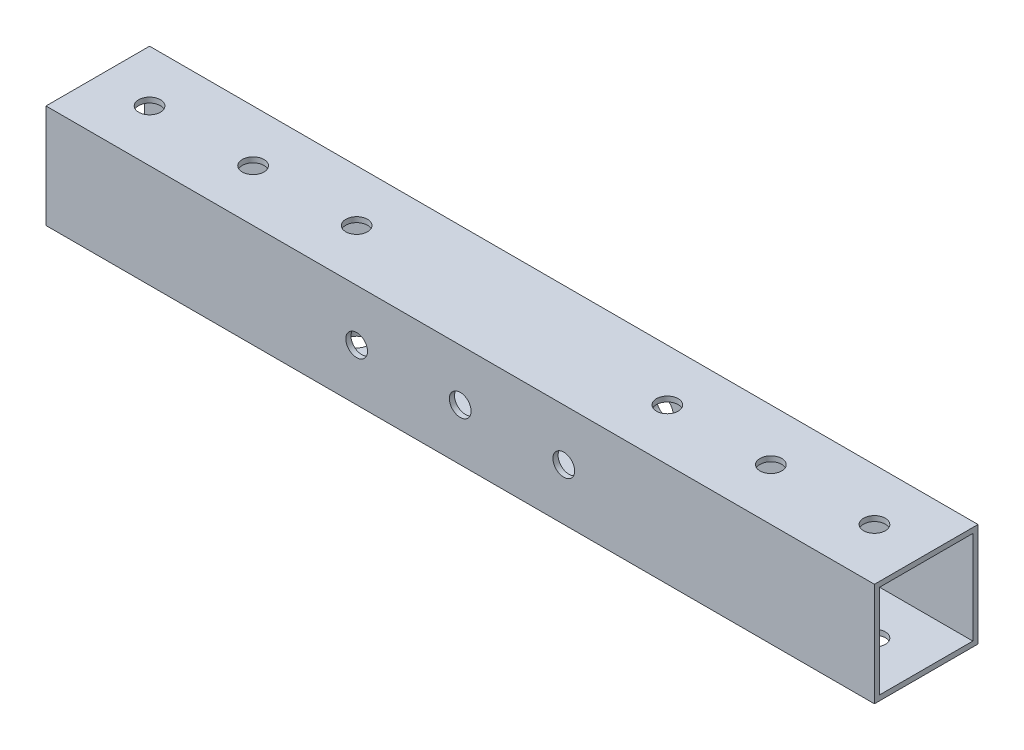
ISO-10303-21;
HEADER;
FILE_DESCRIPTION(('STEP AP214'),'2;1');
FILE_NAME('part.step','',(''),(''),'','','');
FILE_SCHEMA(('AUTOMOTIVE_DESIGN { 1 0 10303 214 1 1 1 1 }'));
ENDSEC;
DATA;
#1=APPLICATION_CONTEXT('core data for automotive mechanical design processes');
#2=APPLICATION_PROTOCOL_DEFINITION('international standard','automotive_design',2000,#1);
#3=PRODUCT_CONTEXT('',#1,'mechanical');
#4=PRODUCT('Part','Part','',(#3));
#5=PRODUCT_RELATED_PRODUCT_CATEGORY('part','',(#4));
#6=PRODUCT_DEFINITION_FORMATION('','',#4);
#7=PRODUCT_DEFINITION_CONTEXT('part definition',#1,'design');
#8=PRODUCT_DEFINITION('design','',#6,#7);
#9=PRODUCT_DEFINITION_SHAPE('','',#8);
#10=(LENGTH_UNIT() NAMED_UNIT(*) SI_UNIT(.MILLI.,.METRE.));
#11=(NAMED_UNIT(*) PLANE_ANGLE_UNIT() SI_UNIT($,.RADIAN.));
#12=(NAMED_UNIT(*) SI_UNIT($,.STERADIAN.) SOLID_ANGLE_UNIT());
#13=UNCERTAINTY_MEASURE_WITH_UNIT(LENGTH_MEASURE(1.E-05),#10,'distance_accuracy_value','');
#14=(GEOMETRIC_REPRESENTATION_CONTEXT(3) GLOBAL_UNCERTAINTY_ASSIGNED_CONTEXT((#13)) GLOBAL_UNIT_ASSIGNED_CONTEXT((#10,
#11,#12)) REPRESENTATION_CONTEXT('',''));
#15=CARTESIAN_POINT('',(0.,0.,0.));
#16=DIRECTION('',(0.,0.,1.));
#17=DIRECTION('',(1.,0.,0.));
#18=AXIS2_PLACEMENT_3D('',#15,#16,#17);
#19=CARTESIAN_POINT('',(150.,150.,0.));
#20=DIRECTION('',(0.,-1.,0.));
#21=DIRECTION('',(0.,0.,-1.));
#22=AXIS2_PLACEMENT_3D('',#19,#20,#21);
#23=CYLINDRICAL_SURFACE('',#22,2.10000000000002);
#24=CARTESIAN_POINT('',(150.,-9.00000000000001,0.));
#25=DIRECTION('',(0.,-1.,0.));
#26=DIRECTION('',(0.,0.,-1.));
#27=AXIS2_PLACEMENT_3D('',#24,#25,#26);
#28=CIRCLE('',#27,2.10000000000002);
#29=CARTESIAN_POINT('',(150.,-9.00000000000001,-2.10000000000002));
#30=VERTEX_POINT('',#29);
#31=EDGE_CURVE('E211',#30,#30,#28,.F.);
#32=ORIENTED_EDGE('',*,*,#31,.T.);
#33=EDGE_LOOP('',(#32));
#34=FACE_BOUND('',#33,.T.);
#35=CARTESIAN_POINT('',(150.,-10.,0.));
#36=DIRECTION('',(0.,-1.,0.));
#37=DIRECTION('',(0.,0.,1.));
#38=AXIS2_PLACEMENT_3D('',#35,#36,#37);
#39=CIRCLE('',#38,2.10000000000002);
#40=CARTESIAN_POINT('',(150.,-10.,2.10000000000002));
#41=VERTEX_POINT('',#40);
#42=EDGE_CURVE('E220',#41,#41,#39,.T.);
#43=ORIENTED_EDGE('',*,*,#42,.T.);
#44=EDGE_LOOP('',(#43));
#45=FACE_BOUND('',#44,.T.);
#46=ADVANCED_FACE('F38',(#34,#45),#23,.F.);
#47=CARTESIAN_POINT('',(130.,150.,0.));
#48=DIRECTION('',(0.,-1.,0.));
#49=DIRECTION('',(0.,0.,-1.));
#50=AXIS2_PLACEMENT_3D('',#47,#48,#49);
#51=CYLINDRICAL_SURFACE('',#50,2.09999999999999);
#52=CARTESIAN_POINT('',(130.,-9.00000000000001,0.));
#53=DIRECTION('',(0.,-1.,0.));
#54=DIRECTION('',(0.,0.,-1.));
#55=AXIS2_PLACEMENT_3D('',#52,#53,#54);
#56=CIRCLE('',#55,2.09999999999999);
#57=CARTESIAN_POINT('',(130.,-9.00000000000001,-2.09999999999999));
#58=VERTEX_POINT('',#57);
#59=EDGE_CURVE('E207',#58,#58,#56,.F.);
#60=ORIENTED_EDGE('',*,*,#59,.T.);
#61=EDGE_LOOP('',(#60));
#62=FACE_BOUND('',#61,.T.);
#63=CARTESIAN_POINT('',(130.,-10.,0.));
#64=DIRECTION('',(0.,-1.,0.));
#65=DIRECTION('',(0.,0.,1.));
#66=AXIS2_PLACEMENT_3D('',#63,#64,#65);
#67=CIRCLE('',#66,2.09999999999999);
#68=CARTESIAN_POINT('',(130.,-10.,2.09999999999999));
#69=VERTEX_POINT('',#68);
#70=EDGE_CURVE('E257',#69,#69,#67,.T.);
#71=ORIENTED_EDGE('',*,*,#70,.T.);
#72=EDGE_LOOP('',(#71));
#73=FACE_BOUND('',#72,.T.);
#74=ADVANCED_FACE('F354',(#62,#73),#51,.F.);
#75=CARTESIAN_POINT('',(110.,150.,0.));
#76=DIRECTION('',(0.,-1.,0.));
#77=DIRECTION('',(0.,0.,-1.));
#78=AXIS2_PLACEMENT_3D('',#75,#76,#77);
#79=CYLINDRICAL_SURFACE('',#78,2.1);
#80=CARTESIAN_POINT('',(110.,-9.00000000000001,0.));
#81=DIRECTION('',(0.,-1.,0.));
#82=DIRECTION('',(0.,0.,-1.));
#83=AXIS2_PLACEMENT_3D('',#80,#81,#82);
#84=CIRCLE('',#83,2.1);
#85=CARTESIAN_POINT('',(110.,-9.00000000000001,-2.1));
#86=VERTEX_POINT('',#85);
#87=EDGE_CURVE('E203',#86,#86,#84,.F.);
#88=ORIENTED_EDGE('',*,*,#87,.T.);
#89=EDGE_LOOP('',(#88));
#90=FACE_BOUND('',#89,.T.);
#91=CARTESIAN_POINT('',(110.,-10.,0.));
#92=DIRECTION('',(0.,-1.,0.));
#93=DIRECTION('',(0.,0.,1.));
#94=AXIS2_PLACEMENT_3D('',#91,#92,#93);
#95=CIRCLE('',#94,2.1);
#96=CARTESIAN_POINT('',(110.,-10.,2.1));
#97=VERTEX_POINT('',#96);
#98=EDGE_CURVE('E253',#97,#97,#95,.T.);
#99=ORIENTED_EDGE('',*,*,#98,.T.);
#100=EDGE_LOOP('',(#99));
#101=FACE_BOUND('',#100,.T.);
#102=ADVANCED_FACE('F362',(#90,#101),#79,.F.);
#103=CARTESIAN_POINT('',(50.,150.,0.));
#104=DIRECTION('',(0.,-1.,0.));
#105=DIRECTION('',(0.,0.,-1.));
#106=AXIS2_PLACEMENT_3D('',#103,#104,#105);
#107=CYLINDRICAL_SURFACE('',#106,2.1);
#108=CARTESIAN_POINT('',(50.,-9.00000000000001,0.));
#109=DIRECTION('',(0.,-1.,0.));
#110=DIRECTION('',(0.,0.,-1.));
#111=AXIS2_PLACEMENT_3D('',#108,#109,#110);
#112=CIRCLE('',#111,2.1);
#113=CARTESIAN_POINT('',(50.,-9.00000000000001,-2.1));
#114=VERTEX_POINT('',#113);
#115=EDGE_CURVE('E199',#114,#114,#112,.F.);
#116=ORIENTED_EDGE('',*,*,#115,.T.);
#117=EDGE_LOOP('',(#116));
#118=FACE_BOUND('',#117,.T.);
#119=CARTESIAN_POINT('',(50.,-10.,0.));
#120=DIRECTION('',(0.,-1.,0.));
#121=DIRECTION('',(0.,0.,-1.));
#122=AXIS2_PLACEMENT_3D('',#119,#120,#121);
#123=CIRCLE('',#122,2.1);
#124=CARTESIAN_POINT('',(50.,-10.,-2.1));
#125=VERTEX_POINT('',#124);
#126=EDGE_CURVE('E249',#125,#125,#123,.T.);
#127=ORIENTED_EDGE('',*,*,#126,.T.);
#128=EDGE_LOOP('',(#127));
#129=FACE_BOUND('',#128,.T.);
#130=ADVANCED_FACE('F486',(#118,#129),#107,.F.);
#131=CARTESIAN_POINT('',(30.,150.,0.));
#132=DIRECTION('',(0.,-1.,0.));
#133=DIRECTION('',(0.,0.,-1.));
#134=AXIS2_PLACEMENT_3D('',#131,#132,#133);
#135=CYLINDRICAL_SURFACE('',#134,2.1);
#136=CARTESIAN_POINT('',(30.,-9.00000000000001,0.));
#137=DIRECTION('',(0.,-1.,0.));
#138=DIRECTION('',(0.,0.,-1.));
#139=AXIS2_PLACEMENT_3D('',#136,#137,#138);
#140=CIRCLE('',#139,2.1);
#141=CARTESIAN_POINT('',(30.,-9.00000000000001,-2.1));
#142=VERTEX_POINT('',#141);
#143=EDGE_CURVE('E195',#142,#142,#140,.F.);
#144=ORIENTED_EDGE('',*,*,#143,.T.);
#145=EDGE_LOOP('',(#144));
#146=FACE_BOUND('',#145,.T.);
#147=CARTESIAN_POINT('',(30.,-10.,0.));
#148=DIRECTION('',(0.,-1.,0.));
#149=DIRECTION('',(0.,0.,-1.));
#150=AXIS2_PLACEMENT_3D('',#147,#148,#149);
#151=CIRCLE('',#150,2.1);
#152=CARTESIAN_POINT('',(30.,-10.,-2.1));
#153=VERTEX_POINT('',#152);
#154=EDGE_CURVE('E245',#153,#153,#151,.T.);
#155=ORIENTED_EDGE('',*,*,#154,.T.);
#156=EDGE_LOOP('',(#155));
#157=FACE_BOUND('',#156,.T.);
#158=ADVANCED_FACE('F435',(#146,#157),#135,.F.);
#159=CARTESIAN_POINT('',(10.,150.,0.));
#160=DIRECTION('',(0.,-1.,0.));
#161=DIRECTION('',(0.,0.,-1.));
#162=AXIS2_PLACEMENT_3D('',#159,#160,#161);
#163=CYLINDRICAL_SURFACE('',#162,2.1);
#164=CARTESIAN_POINT('',(10.,-9.00000000000001,0.));
#165=DIRECTION('',(0.,-1.,0.));
#166=DIRECTION('',(0.,0.,-1.));
#167=AXIS2_PLACEMENT_3D('',#164,#165,#166);
#168=CIRCLE('',#167,2.1);
#169=CARTESIAN_POINT('',(10.,-9.00000000000001,-2.1));
#170=VERTEX_POINT('',#169);
#171=EDGE_CURVE('E42',#170,#170,#168,.F.);
#172=ORIENTED_EDGE('',*,*,#171,.T.);
#173=EDGE_LOOP('',(#172));
#174=FACE_BOUND('',#173,.T.);
#175=CARTESIAN_POINT('',(10.,-10.,0.));
#176=DIRECTION('',(0.,-1.,0.));
#177=DIRECTION('',(0.,0.,-1.));
#178=AXIS2_PLACEMENT_3D('',#175,#176,#177);
#179=CIRCLE('',#178,2.1);
#180=CARTESIAN_POINT('',(10.,-10.,-2.1));
#181=VERTEX_POINT('',#180);
#182=EDGE_CURVE('E240',#181,#181,#179,.T.);
#183=ORIENTED_EDGE('',*,*,#182,.T.);
#184=EDGE_LOOP('',(#183));
#185=FACE_BOUND('',#184,.T.);
#186=ADVANCED_FACE('F423',(#174,#185),#163,.F.);
#187=CARTESIAN_POINT('',(100.,0.,-10.));
#188=DIRECTION('',(0.,0.,1.));
#189=DIRECTION('',(1.,0.,0.));
#190=AXIS2_PLACEMENT_3D('',#187,#188,#189);
#191=CYLINDRICAL_SURFACE('',#190,2.09999999999999);
#192=CARTESIAN_POINT('',(100.,0.,9.));
#193=DIRECTION('',(0.,0.,1.));
#194=DIRECTION('',(0.,-1.,0.));
#195=AXIS2_PLACEMENT_3D('',#192,#193,#194);
#196=CIRCLE('',#195,2.09999999999999);
#197=CARTESIAN_POINT('',(100.,-2.09999999999998,9.));
#198=VERTEX_POINT('',#197);
#199=EDGE_CURVE('E170',#198,#198,#196,.F.);
#200=ORIENTED_EDGE('',*,*,#199,.T.);
#201=EDGE_LOOP('',(#200));
#202=FACE_BOUND('',#201,.T.);
#203=CARTESIAN_POINT('',(100.,0.,10.));
#204=DIRECTION('',(0.,0.,1.));
#205=DIRECTION('',(1.,0.,0.));
#206=AXIS2_PLACEMENT_3D('',#203,#204,#205);
#207=CIRCLE('',#206,2.09999999999999);
#208=CARTESIAN_POINT('',(102.1,0.,10.));
#209=VERTEX_POINT('',#208);
#210=EDGE_CURVE('E215',#209,#209,#207,.T.);
#211=ORIENTED_EDGE('',*,*,#210,.T.);
#212=EDGE_LOOP('',(#211));
#213=FACE_BOUND('',#212,.T.);
#214=ADVANCED_FACE('F420',(#202,#213),#191,.F.);
#215=CARTESIAN_POINT('',(80.,0.,-10.));
#216=DIRECTION('',(0.,0.,1.));
#217=DIRECTION('',(1.,0.,0.));
#218=AXIS2_PLACEMENT_3D('',#215,#216,#217);
#219=CYLINDRICAL_SURFACE('',#218,2.1);
#220=CARTESIAN_POINT('',(80.,0.,9.));
#221=DIRECTION('',(0.,0.,1.));
#222=DIRECTION('',(0.,-1.,0.));
#223=AXIS2_PLACEMENT_3D('',#220,#221,#222);
#224=CIRCLE('',#223,2.1);
#225=CARTESIAN_POINT('',(80.,-2.09999999999999,9.));
#226=VERTEX_POINT('',#225);
#227=EDGE_CURVE('E166',#226,#226,#224,.F.);
#228=ORIENTED_EDGE('',*,*,#227,.T.);
#229=EDGE_LOOP('',(#228));
#230=FACE_BOUND('',#229,.T.);
#231=CARTESIAN_POINT('',(80.,0.,10.));
#232=DIRECTION('',(0.,0.,1.));
#233=DIRECTION('',(1.,0.,0.));
#234=AXIS2_PLACEMENT_3D('',#231,#232,#233);
#235=CIRCLE('',#234,2.1);
#236=CARTESIAN_POINT('',(82.1,0.,10.));
#237=VERTEX_POINT('',#236);
#238=EDGE_CURVE('E229',#237,#237,#235,.T.);
#239=ORIENTED_EDGE('',*,*,#238,.T.);
#240=EDGE_LOOP('',(#239));
#241=FACE_BOUND('',#240,.T.);
#242=ADVANCED_FACE('F422',(#230,#241),#219,.F.);
#243=CARTESIAN_POINT('',(60.,0.,-10.));
#244=DIRECTION('',(0.,0.,1.));
#245=DIRECTION('',(1.,0.,0.));
#246=AXIS2_PLACEMENT_3D('',#243,#244,#245);
#247=CYLINDRICAL_SURFACE('',#246,2.1);
#248=CARTESIAN_POINT('',(60.,0.,9.));
#249=DIRECTION('',(0.,0.,1.));
#250=DIRECTION('',(0.,-1.,0.));
#251=AXIS2_PLACEMENT_3D('',#248,#249,#250);
#252=CIRCLE('',#251,2.1);
#253=CARTESIAN_POINT('',(60.,-2.09999999999999,9.));
#254=VERTEX_POINT('',#253);
#255=EDGE_CURVE('E165',#254,#254,#252,.F.);
#256=ORIENTED_EDGE('',*,*,#255,.T.);
#257=EDGE_LOOP('',(#256));
#258=FACE_BOUND('',#257,.T.);
#259=CARTESIAN_POINT('',(60.,0.,10.));
#260=DIRECTION('',(0.,0.,1.));
#261=DIRECTION('',(1.,0.,0.));
#262=AXIS2_PLACEMENT_3D('',#259,#260,#261);
#263=CIRCLE('',#262,2.1);
#264=CARTESIAN_POINT('',(62.1,0.,10.));
#265=VERTEX_POINT('',#264);
#266=EDGE_CURVE('E221',#265,#265,#263,.T.);
#267=ORIENTED_EDGE('',*,*,#266,.T.);
#268=EDGE_LOOP('',(#267));
#269=FACE_BOUND('',#268,.T.);
#270=ADVANCED_FACE('F431',(#258,#269),#247,.F.);
#271=CARTESIAN_POINT('',(160.,10.,-10.));
#272=DIRECTION('',(0.,0.,1.));
#273=DIRECTION('',(0.,-1.,0.));
#274=AXIS2_PLACEMENT_3D('',#271,#272,#273);
#275=PLANE('',#274);
#276=CARTESIAN_POINT('',(60.,0.,-10.));
#277=DIRECTION('',(0.,0.,1.));
#278=DIRECTION('',(1.,0.,0.));
#279=AXIS2_PLACEMENT_3D('',#276,#277,#278);
#280=CIRCLE('',#279,2.1);
#281=CARTESIAN_POINT('',(62.1,0.,-10.));
#282=VERTEX_POINT('',#281);
#283=EDGE_CURVE('E216',#282,#282,#280,.T.);
#284=ORIENTED_EDGE('',*,*,#283,.T.);
#285=EDGE_LOOP('',(#284));
#286=FACE_BOUND('',#285,.T.);
#287=CARTESIAN_POINT('',(80.,0.,-10.));
#288=DIRECTION('',(0.,0.,1.));
#289=DIRECTION('',(1.,0.,0.));
#290=AXIS2_PLACEMENT_3D('',#287,#288,#289);
#291=CIRCLE('',#290,2.1);
#292=CARTESIAN_POINT('',(82.1,0.,-10.));
#293=VERTEX_POINT('',#292);
#294=EDGE_CURVE('E225',#293,#293,#291,.T.);
#295=ORIENTED_EDGE('',*,*,#294,.T.);
#296=EDGE_LOOP('',(#295));
#297=FACE_BOUND('',#296,.T.);
#298=CARTESIAN_POINT('',(100.,0.,-10.));
#299=DIRECTION('',(0.,0.,1.));
#300=DIRECTION('',(1.,0.,0.));
#301=AXIS2_PLACEMENT_3D('',#298,#299,#300);
#302=CIRCLE('',#301,2.09999999999999);
#303=CARTESIAN_POINT('',(102.1,0.,-10.));
#304=VERTEX_POINT('',#303);
#305=EDGE_CURVE('E233',#304,#304,#302,.T.);
#306=ORIENTED_EDGE('',*,*,#305,.T.);
#307=EDGE_LOOP('',(#306));
#308=FACE_BOUND('',#307,.T.);
#309=DIRECTION('',(0.,1.,0.));
#310=VECTOR('',#309,1.);
#311=CARTESIAN_POINT('',(0.,10.,-10.));
#312=LINE('',#311,#310);
#313=CARTESIAN_POINT('',(0.,-10.,-10.));
#314=VERTEX_POINT('',#313);
#315=CARTESIAN_POINT('',(0.,10.,-10.));
#316=VERTEX_POINT('',#315);
#317=EDGE_CURVE('E287',#314,#316,#312,.T.);
#318=ORIENTED_EDGE('',*,*,#317,.T.);
#319=DIRECTION('',(-1.,0.,0.));
#320=VECTOR('',#319,1.);
#321=CARTESIAN_POINT('',(160.,10.,-10.));
#322=LINE('',#321,#320);
#323=CARTESIAN_POINT('',(160.,10.,-10.));
#324=VERTEX_POINT('',#323);
#325=EDGE_CURVE('E11',#324,#316,#322,.T.);
#326=ORIENTED_EDGE('',*,*,#325,.F.);
#327=DIRECTION('',(0.,1.,0.));
#328=VECTOR('',#327,1.);
#329=CARTESIAN_POINT('',(160.,10.,-10.));
#330=LINE('',#329,#328);
#331=CARTESIAN_POINT('',(160.,-10.,-10.));
#332=VERTEX_POINT('',#331);
#333=EDGE_CURVE('E288',#332,#324,#330,.T.);
#334=ORIENTED_EDGE('',*,*,#333,.F.);
#335=DIRECTION('',(-1.,0.,0.));
#336=VECTOR('',#335,1.);
#337=CARTESIAN_POINT('',(160.,-10.,-10.));
#338=LINE('',#337,#336);
#339=EDGE_CURVE('E302',#332,#314,#338,.T.);
#340=ORIENTED_EDGE('',*,*,#339,.T.);
#341=EDGE_LOOP('',(#318,#326,#334,#340));
#342=FACE_BOUND('',#341,.T.);
#343=ADVANCED_FACE('F40',(#286,#297,#308,#342),#275,.F.);
#344=CARTESIAN_POINT('',(160.,10.,10.));
#345=DIRECTION('',(0.,-1.,0.));
#346=DIRECTION('',(0.,0.,-1.));
#347=AXIS2_PLACEMENT_3D('',#344,#345,#346);
#348=PLANE('',#347);
#349=CARTESIAN_POINT('',(10.,10.,0.));
#350=DIRECTION('',(0.,-1.,0.));
#351=DIRECTION('',(0.,0.,-1.));
#352=AXIS2_PLACEMENT_3D('',#349,#350,#351);
#353=CIRCLE('',#352,2.1);
#354=CARTESIAN_POINT('',(10.,10.,-2.1));
#355=VERTEX_POINT('',#354);
#356=EDGE_CURVE('E283',#355,#355,#353,.T.);
#357=ORIENTED_EDGE('',*,*,#356,.T.);
#358=EDGE_LOOP('',(#357));
#359=FACE_BOUND('',#358,.T.);
#360=CARTESIAN_POINT('',(30.,10.,0.));
#361=DIRECTION('',(0.,-1.,0.));
#362=DIRECTION('',(0.,0.,-1.));
#363=AXIS2_PLACEMENT_3D('',#360,#361,#362);
#364=CIRCLE('',#363,2.1);
#365=CARTESIAN_POINT('',(30.,10.,-2.1));
#366=VERTEX_POINT('',#365);
#367=EDGE_CURVE('E279',#366,#366,#364,.T.);
#368=ORIENTED_EDGE('',*,*,#367,.T.);
#369=EDGE_LOOP('',(#368));
#370=FACE_BOUND('',#369,.T.);
#371=CARTESIAN_POINT('',(50.,10.,0.));
#372=DIRECTION('',(0.,-1.,0.));
#373=DIRECTION('',(0.,0.,-1.));
#374=AXIS2_PLACEMENT_3D('',#371,#372,#373);
#375=CIRCLE('',#374,2.1);
#376=CARTESIAN_POINT('',(50.,10.,-2.1));
#377=VERTEX_POINT('',#376);
#378=EDGE_CURVE('E275',#377,#377,#375,.T.);
#379=ORIENTED_EDGE('',*,*,#378,.T.);
#380=EDGE_LOOP('',(#379));
#381=FACE_BOUND('',#380,.T.);
#382=CARTESIAN_POINT('',(110.,10.,0.));
#383=DIRECTION('',(0.,-1.,0.));
#384=DIRECTION('',(0.,0.,-1.));
#385=AXIS2_PLACEMENT_3D('',#382,#383,#384);
#386=CIRCLE('',#385,2.1);
#387=CARTESIAN_POINT('',(110.,10.,-2.1));
#388=VERTEX_POINT('',#387);
#389=EDGE_CURVE('E271',#388,#388,#386,.T.);
#390=ORIENTED_EDGE('',*,*,#389,.T.);
#391=EDGE_LOOP('',(#390));
#392=FACE_BOUND('',#391,.T.);
#393=CARTESIAN_POINT('',(130.,10.,0.));
#394=DIRECTION('',(0.,-1.,0.));
#395=DIRECTION('',(0.,0.,-1.));
#396=AXIS2_PLACEMENT_3D('',#393,#394,#395);
#397=CIRCLE('',#396,2.09999999999999);
#398=CARTESIAN_POINT('',(130.,10.,-2.09999999999999));
#399=VERTEX_POINT('',#398);
#400=EDGE_CURVE('E267',#399,#399,#397,.T.);
#401=ORIENTED_EDGE('',*,*,#400,.T.);
#402=EDGE_LOOP('',(#401));
#403=FACE_BOUND('',#402,.T.);
#404=CARTESIAN_POINT('',(150.,10.,0.));
#405=DIRECTION('',(0.,-1.,0.));
#406=DIRECTION('',(0.,0.,-1.));
#407=AXIS2_PLACEMENT_3D('',#404,#405,#406);
#408=CIRCLE('',#407,2.10000000000002);
#409=CARTESIAN_POINT('',(150.,10.,-2.10000000000002));
#410=VERTEX_POINT('',#409);
#411=EDGE_CURVE('E244',#410,#410,#408,.T.);
#412=ORIENTED_EDGE('',*,*,#411,.T.);
#413=EDGE_LOOP('',(#412));
#414=FACE_BOUND('',#413,.T.);
#415=DIRECTION('',(0.,0.,1.));
#416=VECTOR('',#415,1.);
#417=CARTESIAN_POINT('',(0.,10.,10.));
#418=LINE('',#417,#416);
#419=CARTESIAN_POINT('',(0.,10.,10.));
#420=VERTEX_POINT('',#419);
#421=EDGE_CURVE('E306',#316,#420,#418,.T.);
#422=ORIENTED_EDGE('',*,*,#421,.T.);
#423=DIRECTION('',(-1.,0.,0.));
#424=VECTOR('',#423,1.);
#425=CARTESIAN_POINT('',(160.,10.,10.));
#426=LINE('',#425,#424);
#427=CARTESIAN_POINT('',(160.,10.,10.));
#428=VERTEX_POINT('',#427);
#429=EDGE_CURVE('E48',#428,#420,#426,.T.);
#430=ORIENTED_EDGE('',*,*,#429,.F.);
#431=DIRECTION('',(0.,0.,1.));
#432=VECTOR('',#431,1.);
#433=CARTESIAN_POINT('',(160.,10.,10.));
#434=LINE('',#433,#432);
#435=EDGE_CURVE('E292',#324,#428,#434,.T.);
#436=ORIENTED_EDGE('',*,*,#435,.F.);
#437=ORIENTED_EDGE('',*,*,#325,.T.);
#438=EDGE_LOOP('',(#422,#430,#436,#437));
#439=FACE_BOUND('',#438,.T.);
#440=ADVANCED_FACE('F383',(#359,#370,#381,#392,#403,#414,#439),#348,.F.);
#441=CARTESIAN_POINT('',(160.,10.,10.));
#442=DIRECTION('',(0.,0.,-1.));
#443=DIRECTION('',(0.,1.,0.));
#444=AXIS2_PLACEMENT_3D('',#441,#442,#443);
#445=PLANE('',#444);
#446=ORIENTED_EDGE('',*,*,#266,.F.);
#447=EDGE_LOOP('',(#446));
#448=FACE_BOUND('',#447,.T.);
#449=ORIENTED_EDGE('',*,*,#238,.F.);
#450=EDGE_LOOP('',(#449));
#451=FACE_BOUND('',#450,.T.);
#452=ORIENTED_EDGE('',*,*,#210,.F.);
#453=EDGE_LOOP('',(#452));
#454=FACE_BOUND('',#453,.T.);
#455=DIRECTION('',(0.,-1.,0.));
#456=VECTOR('',#455,1.);
#457=CARTESIAN_POINT('',(0.,10.,10.));
#458=LINE('',#457,#456);
#459=CARTESIAN_POINT('',(0.,-10.,10.));
#460=VERTEX_POINT('',#459);
#461=EDGE_CURVE('E309',#420,#460,#458,.T.);
#462=ORIENTED_EDGE('',*,*,#461,.T.);
#463=DIRECTION('',(-1.,0.,0.));
#464=VECTOR('',#463,1.);
#465=CARTESIAN_POINT('',(160.,-10.,10.));
#466=LINE('',#465,#464);
#467=CARTESIAN_POINT('',(160.,-10.,10.));
#468=VERTEX_POINT('',#467);
#469=EDGE_CURVE('E317',#468,#460,#466,.T.);
#470=ORIENTED_EDGE('',*,*,#469,.F.);
#471=DIRECTION('',(0.,-1.,0.));
#472=VECTOR('',#471,1.);
#473=CARTESIAN_POINT('',(160.,10.,10.));
#474=LINE('',#473,#472);
#475=EDGE_CURVE('E296',#428,#468,#474,.T.);
#476=ORIENTED_EDGE('',*,*,#475,.F.);
#477=ORIENTED_EDGE('',*,*,#429,.T.);
#478=EDGE_LOOP('',(#462,#470,#476,#477));
#479=FACE_BOUND('',#478,.T.);
#480=ADVANCED_FACE('F386',(#448,#451,#454,#479),#445,.F.);
#481=CARTESIAN_POINT('',(160.,-10.,10.));
#482=DIRECTION('',(0.,1.,0.));
#483=DIRECTION('',(0.,0.,1.));
#484=AXIS2_PLACEMENT_3D('',#481,#482,#483);
#485=PLANE('',#484);
#486=ORIENTED_EDGE('',*,*,#182,.F.);
#487=EDGE_LOOP('',(#486));
#488=FACE_BOUND('',#487,.T.);
#489=ORIENTED_EDGE('',*,*,#154,.F.);
#490=EDGE_LOOP('',(#489));
#491=FACE_BOUND('',#490,.T.);
#492=ORIENTED_EDGE('',*,*,#126,.F.);
#493=EDGE_LOOP('',(#492));
#494=FACE_BOUND('',#493,.T.);
#495=ORIENTED_EDGE('',*,*,#98,.F.);
#496=EDGE_LOOP('',(#495));
#497=FACE_BOUND('',#496,.T.);
#498=ORIENTED_EDGE('',*,*,#70,.F.);
#499=EDGE_LOOP('',(#498));
#500=FACE_BOUND('',#499,.T.);
#501=ORIENTED_EDGE('',*,*,#42,.F.);
#502=EDGE_LOOP('',(#501));
#503=FACE_BOUND('',#502,.T.);
#504=DIRECTION('',(0.,0.,-1.));
#505=VECTOR('',#504,1.);
#506=CARTESIAN_POINT('',(0.,-10.,10.));
#507=LINE('',#506,#505);
#508=EDGE_CURVE('E293',#460,#314,#507,.T.);
#509=ORIENTED_EDGE('',*,*,#508,.T.);
#510=ORIENTED_EDGE('',*,*,#339,.F.);
#511=DIRECTION('',(0.,0.,-1.));
#512=VECTOR('',#511,1.);
#513=CARTESIAN_POINT('',(160.,-10.,10.));
#514=LINE('',#513,#512);
#515=EDGE_CURVE('E299',#468,#332,#514,.T.);
#516=ORIENTED_EDGE('',*,*,#515,.F.);
#517=ORIENTED_EDGE('',*,*,#469,.T.);
#518=EDGE_LOOP('',(#509,#510,#516,#517));
#519=FACE_BOUND('',#518,.T.);
#520=ADVANCED_FACE('F399',(#488,#491,#494,#497,#500,#503,#519),#485,.F.);
#521=CARTESIAN_POINT('',(160.,0.,0.));
#522=DIRECTION('',(1.,0.,0.));
#523=DIRECTION('',(0.,0.,-1.));
#524=AXIS2_PLACEMENT_3D('',#521,#522,#523);
#525=PLANE('',#524);
#526=DIRECTION('',(0.,1.,0.));
#527=VECTOR('',#526,1.);
#528=CARTESIAN_POINT('',(160.,9.,9.));
#529=LINE('',#528,#527);
#530=CARTESIAN_POINT('',(160.,-9.,9.));
#531=VERTEX_POINT('',#530);
#532=CARTESIAN_POINT('',(160.,9.,9.));
#533=VERTEX_POINT('',#532);
#534=EDGE_CURVE('E109',#531,#533,#529,.T.);
#535=ORIENTED_EDGE('',*,*,#534,.T.);
#536=DIRECTION('',(0.,0.,-1.));
#537=VECTOR('',#536,1.);
#538=CARTESIAN_POINT('',(160.,9.,-9.));
#539=LINE('',#538,#537);
#540=CARTESIAN_POINT('',(160.,9.,-9.));
#541=VERTEX_POINT('',#540);
#542=EDGE_CURVE('E119',#533,#541,#539,.T.);
#543=ORIENTED_EDGE('',*,*,#542,.T.);
#544=DIRECTION('',(0.,-1.,0.));
#545=VECTOR('',#544,1.);
#546=CARTESIAN_POINT('',(160.,9.,-9.));
#547=LINE('',#546,#545);
#548=CARTESIAN_POINT('',(160.,-9.,-9.));
#549=VERTEX_POINT('',#548);
#550=EDGE_CURVE('E56',#541,#549,#547,.T.);
#551=ORIENTED_EDGE('',*,*,#550,.T.);
#552=DIRECTION('',(0.,0.,1.));
#553=VECTOR('',#552,1.);
#554=CARTESIAN_POINT('',(160.,-9.,-9.));
#555=LINE('',#554,#553);
#556=EDGE_CURVE('E116',#549,#531,#555,.T.);
#557=ORIENTED_EDGE('',*,*,#556,.T.);
#558=EDGE_LOOP('',(#535,#543,#551,#557));
#559=FACE_BOUND('',#558,.T.);
#560=ORIENTED_EDGE('',*,*,#333,.T.);
#561=ORIENTED_EDGE('',*,*,#435,.T.);
#562=ORIENTED_EDGE('',*,*,#475,.T.);
#563=ORIENTED_EDGE('',*,*,#515,.T.);
#564=EDGE_LOOP('',(#560,#561,#562,#563));
#565=FACE_BOUND('',#564,.T.);
#566=ADVANCED_FACE('F125',(#559,#565),#525,.T.);
#567=CARTESIAN_POINT('',(0.,0.,0.));
#568=DIRECTION('',(1.,0.,0.));
#569=DIRECTION('',(0.,0.,-1.));
#570=AXIS2_PLACEMENT_3D('',#567,#568,#569);
#571=PLANE('',#570);
#572=DIRECTION('',(0.,0.,-1.));
#573=VECTOR('',#572,1.);
#574=CARTESIAN_POINT('',(0.,9.,-9.));
#575=LINE('',#574,#573);
#576=CARTESIAN_POINT('',(0.,9.,9.));
#577=VERTEX_POINT('',#576);
#578=CARTESIAN_POINT('',(0.,9.,-9.));
#579=VERTEX_POINT('',#578);
#580=EDGE_CURVE('E142',#577,#579,#575,.T.);
#581=ORIENTED_EDGE('',*,*,#580,.F.);
#582=DIRECTION('',(0.,1.,0.));
#583=VECTOR('',#582,1.);
#584=CARTESIAN_POINT('',(0.,9.,9.));
#585=LINE('',#584,#583);
#586=CARTESIAN_POINT('',(0.,-9.,9.));
#587=VERTEX_POINT('',#586);
#588=EDGE_CURVE('E64',#587,#577,#585,.T.);
#589=ORIENTED_EDGE('',*,*,#588,.F.);
#590=DIRECTION('',(0.,0.,1.));
#591=VECTOR('',#590,1.);
#592=CARTESIAN_POINT('',(0.,-9.,-9.));
#593=LINE('',#592,#591);
#594=CARTESIAN_POINT('',(0.,-9.,-9.));
#595=VERTEX_POINT('',#594);
#596=EDGE_CURVE('E129',#595,#587,#593,.T.);
#597=ORIENTED_EDGE('',*,*,#596,.F.);
#598=DIRECTION('',(0.,-1.,0.));
#599=VECTOR('',#598,1.);
#600=CARTESIAN_POINT('',(0.,9.,-9.));
#601=LINE('',#600,#599);
#602=EDGE_CURVE('E133',#579,#595,#601,.T.);
#603=ORIENTED_EDGE('',*,*,#602,.F.);
#604=EDGE_LOOP('',(#581,#589,#597,#603));
#605=FACE_BOUND('',#604,.T.);
#606=ORIENTED_EDGE('',*,*,#317,.F.);
#607=ORIENTED_EDGE('',*,*,#508,.F.);
#608=ORIENTED_EDGE('',*,*,#461,.F.);
#609=ORIENTED_EDGE('',*,*,#421,.F.);
#610=EDGE_LOOP('',(#606,#607,#608,#609));
#611=FACE_BOUND('',#610,.T.);
#612=ADVANCED_FACE('F369',(#605,#611),#571,.F.);
#613=CARTESIAN_POINT('',(150.,9.00000000000001,0.));
#614=DIRECTION('',(0.,1.,0.));
#615=DIRECTION('',(0.,0.,1.));
#616=AXIS2_PLACEMENT_3D('',#613,#614,#615);
#617=CIRCLE('',#616,2.10000000000002);
#618=CARTESIAN_POINT('',(150.,9.00000000000001,2.10000000000002));
#619=VERTEX_POINT('',#618);
#620=EDGE_CURVE('E191',#619,#619,#617,.F.);
#621=ORIENTED_EDGE('',*,*,#620,.T.);
#622=EDGE_LOOP('',(#621));
#623=FACE_BOUND('',#622,.T.);
#624=ORIENTED_EDGE('',*,*,#411,.F.);
#625=EDGE_LOOP('',(#624));
#626=FACE_BOUND('',#625,.T.);
#627=ADVANCED_FACE('F357',(#623,#626),#23,.F.);
#628=CARTESIAN_POINT('',(130.,9.00000000000001,0.));
#629=DIRECTION('',(0.,1.,0.));
#630=DIRECTION('',(0.,0.,1.));
#631=AXIS2_PLACEMENT_3D('',#628,#629,#630);
#632=CIRCLE('',#631,2.09999999999999);
#633=CARTESIAN_POINT('',(130.,9.00000000000001,2.09999999999999));
#634=VERTEX_POINT('',#633);
#635=EDGE_CURVE('E187',#634,#634,#632,.F.);
#636=ORIENTED_EDGE('',*,*,#635,.T.);
#637=EDGE_LOOP('',(#636));
#638=FACE_BOUND('',#637,.T.);
#639=ORIENTED_EDGE('',*,*,#400,.F.);
#640=EDGE_LOOP('',(#639));
#641=FACE_BOUND('',#640,.T.);
#642=ADVANCED_FACE('F365',(#638,#641),#51,.F.);
#643=CARTESIAN_POINT('',(110.,9.00000000000001,0.));
#644=DIRECTION('',(0.,1.,0.));
#645=DIRECTION('',(0.,0.,1.));
#646=AXIS2_PLACEMENT_3D('',#643,#644,#645);
#647=CIRCLE('',#646,2.1);
#648=CARTESIAN_POINT('',(110.,9.00000000000001,2.1));
#649=VERTEX_POINT('',#648);
#650=EDGE_CURVE('E183',#649,#649,#647,.F.);
#651=ORIENTED_EDGE('',*,*,#650,.T.);
#652=EDGE_LOOP('',(#651));
#653=FACE_BOUND('',#652,.T.);
#654=ORIENTED_EDGE('',*,*,#389,.F.);
#655=EDGE_LOOP('',(#654));
#656=FACE_BOUND('',#655,.T.);
#657=ADVANCED_FACE('F375',(#653,#656),#79,.F.);
#658=CARTESIAN_POINT('',(50.,9.00000000000001,0.));
#659=DIRECTION('',(0.,1.,0.));
#660=DIRECTION('',(0.,0.,1.));
#661=AXIS2_PLACEMENT_3D('',#658,#659,#660);
#662=CIRCLE('',#661,2.1);
#663=CARTESIAN_POINT('',(50.,9.00000000000001,2.1));
#664=VERTEX_POINT('',#663);
#665=EDGE_CURVE('E179',#664,#664,#662,.F.);
#666=ORIENTED_EDGE('',*,*,#665,.T.);
#667=EDGE_LOOP('',(#666));
#668=FACE_BOUND('',#667,.T.);
#669=ORIENTED_EDGE('',*,*,#378,.F.);
#670=EDGE_LOOP('',(#669));
#671=FACE_BOUND('',#670,.T.);
#672=ADVANCED_FACE('F500',(#668,#671),#107,.F.);
#673=CARTESIAN_POINT('',(30.,9.00000000000001,0.));
#674=DIRECTION('',(0.,1.,0.));
#675=DIRECTION('',(0.,0.,1.));
#676=AXIS2_PLACEMENT_3D('',#673,#674,#675);
#677=CIRCLE('',#676,2.1);
#678=CARTESIAN_POINT('',(30.,9.00000000000001,2.1));
#679=VERTEX_POINT('',#678);
#680=EDGE_CURVE('E175',#679,#679,#677,.F.);
#681=ORIENTED_EDGE('',*,*,#680,.T.);
#682=EDGE_LOOP('',(#681));
#683=FACE_BOUND('',#682,.T.);
#684=ORIENTED_EDGE('',*,*,#367,.F.);
#685=EDGE_LOOP('',(#684));
#686=FACE_BOUND('',#685,.T.);
#687=ADVANCED_FACE('F445',(#683,#686),#135,.F.);
#688=CARTESIAN_POINT('',(10.,9.00000000000001,0.));
#689=DIRECTION('',(0.,1.,0.));
#690=DIRECTION('',(0.,0.,1.));
#691=AXIS2_PLACEMENT_3D('',#688,#689,#690);
#692=CIRCLE('',#691,2.1);
#693=CARTESIAN_POINT('',(10.,9.00000000000001,2.1));
#694=VERTEX_POINT('',#693);
#695=EDGE_CURVE('E174',#694,#694,#692,.F.);
#696=ORIENTED_EDGE('',*,*,#695,.T.);
#697=EDGE_LOOP('',(#696));
#698=FACE_BOUND('',#697,.T.);
#699=ORIENTED_EDGE('',*,*,#356,.F.);
#700=EDGE_LOOP('',(#699));
#701=FACE_BOUND('',#700,.T.);
#702=ADVANCED_FACE('F333',(#698,#701),#163,.F.);
#703=CARTESIAN_POINT('',(100.,0.,-9.));
#704=DIRECTION('',(0.,0.,-1.));
#705=DIRECTION('',(0.,1.,0.));
#706=AXIS2_PLACEMENT_3D('',#703,#704,#705);
#707=CIRCLE('',#706,2.09999999999999);
#708=CARTESIAN_POINT('',(100.,2.1,-9.));
#709=VERTEX_POINT('',#708);
#710=EDGE_CURVE('E161',#709,#709,#707,.F.);
#711=ORIENTED_EDGE('',*,*,#710,.T.);
#712=EDGE_LOOP('',(#711));
#713=FACE_BOUND('',#712,.T.);
#714=ORIENTED_EDGE('',*,*,#305,.F.);
#715=EDGE_LOOP('',(#714));
#716=FACE_BOUND('',#715,.T.);
#717=ADVANCED_FACE('F426',(#713,#716),#191,.F.);
#718=CARTESIAN_POINT('',(80.,0.,-9.));
#719=DIRECTION('',(0.,0.,-1.));
#720=DIRECTION('',(0.,1.,0.));
#721=AXIS2_PLACEMENT_3D('',#718,#719,#720);
#722=CIRCLE('',#721,2.1);
#723=CARTESIAN_POINT('',(80.,2.10000000000002,-9.));
#724=VERTEX_POINT('',#723);
#725=EDGE_CURVE('E157',#724,#724,#722,.F.);
#726=ORIENTED_EDGE('',*,*,#725,.T.);
#727=EDGE_LOOP('',(#726));
#728=FACE_BOUND('',#727,.T.);
#729=ORIENTED_EDGE('',*,*,#294,.F.);
#730=EDGE_LOOP('',(#729));
#731=FACE_BOUND('',#730,.T.);
#732=ADVANCED_FACE('F434',(#728,#731),#219,.F.);
#733=CARTESIAN_POINT('',(60.,0.,-9.));
#734=DIRECTION('',(0.,0.,-1.));
#735=DIRECTION('',(0.,1.,0.));
#736=AXIS2_PLACEMENT_3D('',#733,#734,#735);
#737=CIRCLE('',#736,2.1);
#738=CARTESIAN_POINT('',(60.,2.10000000000002,-9.));
#739=VERTEX_POINT('',#738);
#740=EDGE_CURVE('E151',#739,#739,#737,.F.);
#741=ORIENTED_EDGE('',*,*,#740,.T.);
#742=EDGE_LOOP('',(#741));
#743=FACE_BOUND('',#742,.T.);
#744=ORIENTED_EDGE('',*,*,#283,.F.);
#745=EDGE_LOOP('',(#744));
#746=FACE_BOUND('',#745,.T.);
#747=ADVANCED_FACE('F347',(#743,#746),#247,.F.);
#748=CARTESIAN_POINT('',(160.,-9.,-9.));
#749=DIRECTION('',(0.,-1.,0.));
#750=DIRECTION('',(0.,0.,-1.));
#751=AXIS2_PLACEMENT_3D('',#748,#749,#750);
#752=PLANE('',#751);
#753=ORIENTED_EDGE('',*,*,#59,.F.);
#754=EDGE_LOOP('',(#753));
#755=FACE_BOUND('',#754,.T.);
#756=ORIENTED_EDGE('',*,*,#115,.F.);
#757=EDGE_LOOP('',(#756));
#758=FACE_BOUND('',#757,.T.);
#759=ORIENTED_EDGE('',*,*,#171,.F.);
#760=EDGE_LOOP('',(#759));
#761=FACE_BOUND('',#760,.T.);
#762=ORIENTED_EDGE('',*,*,#596,.T.);
#763=DIRECTION('',(-1.,0.,0.));
#764=VECTOR('',#763,1.);
#765=CARTESIAN_POINT('',(160.,-9.,9.));
#766=LINE('',#765,#764);
#767=EDGE_CURVE('E148',#531,#587,#766,.T.);
#768=ORIENTED_EDGE('',*,*,#767,.F.);
#769=ORIENTED_EDGE('',*,*,#556,.F.);
#770=DIRECTION('',(-1.,0.,0.));
#771=VECTOR('',#770,1.);
#772=CARTESIAN_POINT('',(160.,-9.,-9.));
#773=LINE('',#772,#771);
#774=EDGE_CURVE('E152',#549,#595,#773,.T.);
#775=ORIENTED_EDGE('',*,*,#774,.T.);
#776=EDGE_LOOP('',(#762,#768,#769,#775));
#777=FACE_BOUND('',#776,.T.);
#778=ORIENTED_EDGE('',*,*,#143,.F.);
#779=EDGE_LOOP('',(#778));
#780=FACE_BOUND('',#779,.T.);
#781=ORIENTED_EDGE('',*,*,#87,.F.);
#782=EDGE_LOOP('',(#781));
#783=FACE_BOUND('',#782,.T.);
#784=ORIENTED_EDGE('',*,*,#31,.F.);
#785=EDGE_LOOP('',(#784));
#786=FACE_BOUND('',#785,.T.);
#787=ADVANCED_FACE('F337',(#755,#758,#761,#777,#780,#783,#786),#752,.F.);
#788=CARTESIAN_POINT('',(160.,9.,-9.));
#789=DIRECTION('',(0.,1.,0.));
#790=DIRECTION('',(0.,0.,1.));
#791=AXIS2_PLACEMENT_3D('',#788,#789,#790);
#792=PLANE('',#791);
#793=ORIENTED_EDGE('',*,*,#635,.F.);
#794=EDGE_LOOP('',(#793));
#795=FACE_BOUND('',#794,.T.);
#796=ORIENTED_EDGE('',*,*,#665,.F.);
#797=EDGE_LOOP('',(#796));
#798=FACE_BOUND('',#797,.T.);
#799=ORIENTED_EDGE('',*,*,#695,.F.);
#800=EDGE_LOOP('',(#799));
#801=FACE_BOUND('',#800,.T.);
#802=ORIENTED_EDGE('',*,*,#580,.T.);
#803=DIRECTION('',(-1.,0.,0.));
#804=VECTOR('',#803,1.);
#805=CARTESIAN_POINT('',(160.,9.,-9.));
#806=LINE('',#805,#804);
#807=EDGE_CURVE('E115',#541,#579,#806,.T.);
#808=ORIENTED_EDGE('',*,*,#807,.F.);
#809=ORIENTED_EDGE('',*,*,#542,.F.);
#810=DIRECTION('',(-1.,0.,0.));
#811=VECTOR('',#810,1.);
#812=CARTESIAN_POINT('',(160.,9.,9.));
#813=LINE('',#812,#811);
#814=EDGE_CURVE('E104',#533,#577,#813,.T.);
#815=ORIENTED_EDGE('',*,*,#814,.T.);
#816=EDGE_LOOP('',(#802,#808,#809,#815));
#817=FACE_BOUND('',#816,.T.);
#818=ORIENTED_EDGE('',*,*,#680,.F.);
#819=EDGE_LOOP('',(#818));
#820=FACE_BOUND('',#819,.T.);
#821=ORIENTED_EDGE('',*,*,#650,.F.);
#822=EDGE_LOOP('',(#821));
#823=FACE_BOUND('',#822,.T.);
#824=ORIENTED_EDGE('',*,*,#620,.F.);
#825=EDGE_LOOP('',(#824));
#826=FACE_BOUND('',#825,.T.);
#827=ADVANCED_FACE('F120',(#795,#798,#801,#817,#820,#823,#826),#792,.F.);
#828=CARTESIAN_POINT('',(160.,9.,9.));
#829=DIRECTION('',(0.,0.,1.));
#830=DIRECTION('',(0.,-1.,0.));
#831=AXIS2_PLACEMENT_3D('',#828,#829,#830);
#832=PLANE('',#831);
#833=ORIENTED_EDGE('',*,*,#227,.F.);
#834=EDGE_LOOP('',(#833));
#835=FACE_BOUND('',#834,.T.);
#836=ORIENTED_EDGE('',*,*,#588,.T.);
#837=ORIENTED_EDGE('',*,*,#814,.F.);
#838=ORIENTED_EDGE('',*,*,#534,.F.);
#839=ORIENTED_EDGE('',*,*,#767,.T.);
#840=EDGE_LOOP('',(#836,#837,#838,#839));
#841=FACE_BOUND('',#840,.T.);
#842=ORIENTED_EDGE('',*,*,#255,.F.);
#843=EDGE_LOOP('',(#842));
#844=FACE_BOUND('',#843,.T.);
#845=ORIENTED_EDGE('',*,*,#199,.F.);
#846=EDGE_LOOP('',(#845));
#847=FACE_BOUND('',#846,.T.);
#848=ADVANCED_FACE('F106',(#835,#841,#844,#847),#832,.F.);
#849=CARTESIAN_POINT('',(160.,9.,-9.));
#850=DIRECTION('',(0.,0.,-1.));
#851=DIRECTION('',(0.,1.,0.));
#852=AXIS2_PLACEMENT_3D('',#849,#850,#851);
#853=PLANE('',#852);
#854=ORIENTED_EDGE('',*,*,#725,.F.);
#855=EDGE_LOOP('',(#854));
#856=FACE_BOUND('',#855,.T.);
#857=ORIENTED_EDGE('',*,*,#602,.T.);
#858=ORIENTED_EDGE('',*,*,#774,.F.);
#859=ORIENTED_EDGE('',*,*,#550,.F.);
#860=ORIENTED_EDGE('',*,*,#807,.T.);
#861=EDGE_LOOP('',(#857,#858,#859,#860));
#862=FACE_BOUND('',#861,.T.);
#863=ORIENTED_EDGE('',*,*,#740,.F.);
#864=EDGE_LOOP('',(#863));
#865=FACE_BOUND('',#864,.T.);
#866=ORIENTED_EDGE('',*,*,#710,.F.);
#867=EDGE_LOOP('',(#866));
#868=FACE_BOUND('',#867,.T.);
#869=ADVANCED_FACE('F344',(#856,#862,#865,#868),#853,.F.);
#870=CLOSED_SHELL('',(#46,#74,#102,#130,#158,#186,#214,#242,#270,#343,#440,#480,#520,#566,#612,
#627,#642,#657,#672,#687,#702,#717,#732,#747,#787,#827,#848,#869));
#871=MANIFOLD_SOLID_BREP('B2',#870);
#872=ADVANCED_BREP_SHAPE_REPRESENTATION('',(#18,#871),#14);
#873=SHAPE_DEFINITION_REPRESENTATION(#9,#872);
ENDSEC;
END-ISO-10303-21;
